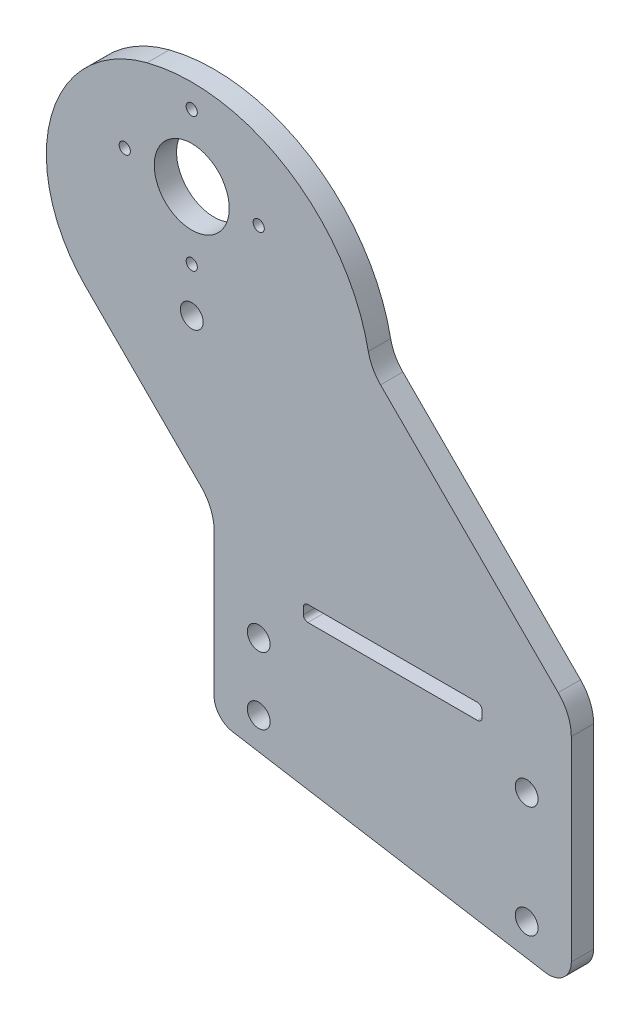
ISO-10303-21;
HEADER;
FILE_DESCRIPTION(('STEP AP214'),'2;1');
FILE_NAME('part.step','',(''),(''),'','','');
FILE_SCHEMA(('AUTOMOTIVE_DESIGN { 1 0 10303 214 1 1 1 1 }'));
ENDSEC;
DATA;
#1=APPLICATION_CONTEXT('core data for automotive mechanical design processes');
#2=APPLICATION_PROTOCOL_DEFINITION('international standard','automotive_design',2000,#1);
#3=PRODUCT_CONTEXT('',#1,'mechanical');
#4=PRODUCT('Part','Part','',(#3));
#5=PRODUCT_RELATED_PRODUCT_CATEGORY('part','',(#4));
#6=PRODUCT_DEFINITION_FORMATION('','',#4);
#7=PRODUCT_DEFINITION_CONTEXT('part definition',#1,'design');
#8=PRODUCT_DEFINITION('design','',#6,#7);
#9=PRODUCT_DEFINITION_SHAPE('','',#8);
#10=(LENGTH_UNIT() NAMED_UNIT(*) SI_UNIT(.MILLI.,.METRE.));
#11=(NAMED_UNIT(*) PLANE_ANGLE_UNIT() SI_UNIT($,.RADIAN.));
#12=(NAMED_UNIT(*) SI_UNIT($,.STERADIAN.) SOLID_ANGLE_UNIT());
#13=UNCERTAINTY_MEASURE_WITH_UNIT(LENGTH_MEASURE(1.E-05),#10,'distance_accuracy_value','');
#14=(GEOMETRIC_REPRESENTATION_CONTEXT(3) GLOBAL_UNCERTAINTY_ASSIGNED_CONTEXT((#13)) GLOBAL_UNIT_ASSIGNED_CONTEXT((#10,
#11,#12)) REPRESENTATION_CONTEXT('',''));
#15=CARTESIAN_POINT('',(0.,0.,0.));
#16=DIRECTION('',(0.,0.,1.));
#17=DIRECTION('',(1.,0.,0.));
#18=AXIS2_PLACEMENT_3D('',#15,#16,#17);
#19=CARTESIAN_POINT('',(0.,28.5999999999999,5.));
#20=DIRECTION('',(0.,0.,-1.));
#21=DIRECTION('',(-1.,0.,0.));
#22=AXIS2_PLACEMENT_3D('',#19,#20,#21);
#23=PLANE('',#22);
#24=CARTESIAN_POINT('',(0.,63.6,5.));
#25=DIRECTION('',(0.,0.,1.));
#26=DIRECTION('',(1.,0.,0.));
#27=AXIS2_PLACEMENT_3D('',#24,#25,#26);
#28=CIRCLE('',#27,1.25);
#29=CARTESIAN_POINT('',(1.25,63.6,5.));
#30=VERTEX_POINT('',#29);
#31=EDGE_CURVE('E308',#30,#30,#28,.T.);
#32=ORIENTED_EDGE('',*,*,#31,.F.);
#33=EDGE_LOOP('',(#32));
#34=FACE_BOUND('',#33,.T.);
#35=CARTESIAN_POINT('',(15.,48.6,5.));
#36=DIRECTION('',(0.,0.,1.));
#37=DIRECTION('',(1.,0.,0.));
#38=AXIS2_PLACEMENT_3D('',#35,#36,#37);
#39=CIRCLE('',#38,1.25);
#40=CARTESIAN_POINT('',(16.25,48.6,5.));
#41=VERTEX_POINT('',#40);
#42=EDGE_CURVE('E683',#41,#41,#39,.T.);
#43=ORIENTED_EDGE('',*,*,#42,.F.);
#44=EDGE_LOOP('',(#43));
#45=FACE_BOUND('',#44,.T.);
#46=CARTESIAN_POINT('',(0.,33.5999999999999,5.));
#47=DIRECTION('',(0.,0.,1.));
#48=DIRECTION('',(1.,0.,0.));
#49=AXIS2_PLACEMENT_3D('',#46,#47,#48);
#50=CIRCLE('',#49,1.25);
#51=CARTESIAN_POINT('',(1.25,33.5999999999999,5.));
#52=VERTEX_POINT('',#51);
#53=EDGE_CURVE('E691',#52,#52,#50,.T.);
#54=ORIENTED_EDGE('',*,*,#53,.F.);
#55=EDGE_LOOP('',(#54));
#56=FACE_BOUND('',#55,.T.);
#57=CARTESIAN_POINT('',(-15.,48.5999999999999,5.));
#58=DIRECTION('',(0.,0.,1.));
#59=DIRECTION('',(1.,0.,0.));
#60=AXIS2_PLACEMENT_3D('',#57,#58,#59);
#61=CIRCLE('',#60,1.25);
#62=CARTESIAN_POINT('',(-13.75,48.5999999999999,5.));
#63=VERTEX_POINT('',#62);
#64=EDGE_CURVE('E696',#63,#63,#61,.T.);
#65=ORIENTED_EDGE('',*,*,#64,.F.);
#66=EDGE_LOOP('',(#65));
#67=FACE_BOUND('',#66,.T.);
#68=DIRECTION('',(0.,1.,0.));
#69=VECTOR('',#68,1.);
#70=CARTESIAN_POINT('',(25.,-19.8999999999999,5.));
#71=LINE('',#70,#69);
#72=CARTESIAN_POINT('',(25.,-21.8999999999999,5.));
#73=VERTEX_POINT('',#72);
#74=CARTESIAN_POINT('',(25.,-20.3999999999999,5.));
#75=VERTEX_POINT('',#74);
#76=EDGE_CURVE('E318',#73,#75,#71,.T.);
#77=ORIENTED_EDGE('',*,*,#76,.T.);
#78=CARTESIAN_POINT('',(26.,-20.3999999999999,5.));
#79=DIRECTION('',(0.,0.,-1.));
#80=DIRECTION('',(-1.,0.,0.));
#81=AXIS2_PLACEMENT_3D('',#78,#79,#80);
#82=CIRCLE('',#81,1.);
#83=CARTESIAN_POINT('',(26.,-19.3999999999999,5.));
#84=VERTEX_POINT('',#83);
#85=EDGE_CURVE('E272',#75,#84,#82,.T.);
#86=ORIENTED_EDGE('',*,*,#85,.T.);
#87=DIRECTION('',(1.,0.,0.));
#88=VECTOR('',#87,1.);
#89=CARTESIAN_POINT('',(65.,-19.3999999999999,5.));
#90=LINE('',#89,#88);
#91=CARTESIAN_POINT('',(64.,-19.3999999999999,5.));
#92=VERTEX_POINT('',#91);
#93=EDGE_CURVE('E312',#84,#92,#90,.T.);
#94=ORIENTED_EDGE('',*,*,#93,.T.);
#95=CARTESIAN_POINT('',(64.,-20.3999999999999,5.));
#96=DIRECTION('',(0.,0.,-1.));
#97=DIRECTION('',(-1.,0.,0.));
#98=AXIS2_PLACEMENT_3D('',#95,#96,#97);
#99=CIRCLE('',#98,1.);
#100=CARTESIAN_POINT('',(65.,-20.3999999999999,5.));
#101=VERTEX_POINT('',#100);
#102=EDGE_CURVE('E260',#92,#101,#99,.T.);
#103=ORIENTED_EDGE('',*,*,#102,.T.);
#104=DIRECTION('',(0.,-1.,0.));
#105=VECTOR('',#104,1.);
#106=CARTESIAN_POINT('',(65.,-19.8999999999999,5.));
#107=LINE('',#106,#105);
#108=CARTESIAN_POINT('',(65.,-21.8999999999999,5.));
#109=VERTEX_POINT('',#108);
#110=EDGE_CURVE('E321',#101,#109,#107,.T.);
#111=ORIENTED_EDGE('',*,*,#110,.T.);
#112=CARTESIAN_POINT('',(64.,-21.8999999999999,5.));
#113=DIRECTION('',(0.,0.,-1.));
#114=DIRECTION('',(-1.,0.,0.));
#115=AXIS2_PLACEMENT_3D('',#112,#113,#114);
#116=CIRCLE('',#115,1.);
#117=CARTESIAN_POINT('',(64.,-22.8999999999999,5.));
#118=VERTEX_POINT('',#117);
#119=EDGE_CURVE('E264',#109,#118,#116,.T.);
#120=ORIENTED_EDGE('',*,*,#119,.T.);
#121=DIRECTION('',(-1.,0.,0.));
#122=VECTOR('',#121,1.);
#123=CARTESIAN_POINT('',(65.,-22.8999999999999,5.));
#124=LINE('',#123,#122);
#125=CARTESIAN_POINT('',(26.,-22.8999999999999,5.));
#126=VERTEX_POINT('',#125);
#127=EDGE_CURVE('E325',#118,#126,#124,.T.);
#128=ORIENTED_EDGE('',*,*,#127,.T.);
#129=CARTESIAN_POINT('',(26.,-21.8999999999999,5.));
#130=DIRECTION('',(0.,0.,-1.));
#131=DIRECTION('',(-1.,0.,0.));
#132=AXIS2_PLACEMENT_3D('',#129,#130,#131);
#133=CIRCLE('',#132,1.);
#134=EDGE_CURVE('E268',#126,#73,#133,.T.);
#135=ORIENTED_EDGE('',*,*,#134,.T.);
#136=EDGE_LOOP('',(#77,#86,#94,#103,#111,#120,#128,#135));
#137=FACE_BOUND('',#136,.T.);
#138=CARTESIAN_POINT('',(15.,-46.3999999999999,5.));
#139=DIRECTION('',(0.,0.,1.));
#140=DIRECTION('',(1.,0.,0.));
#141=AXIS2_PLACEMENT_3D('',#138,#139,#140);
#142=CIRCLE('',#141,2.54999999999999);
#143=CARTESIAN_POINT('',(17.55,-46.3999999999999,5.));
#144=VERTEX_POINT('',#143);
#145=EDGE_CURVE('E340',#144,#144,#142,.T.);
#146=ORIENTED_EDGE('',*,*,#145,.F.);
#147=EDGE_LOOP('',(#146));
#148=FACE_BOUND('',#147,.T.);
#149=CARTESIAN_POINT('',(15.,-31.3999999999999,5.));
#150=DIRECTION('',(0.,0.,1.));
#151=DIRECTION('',(1.,0.,0.));
#152=AXIS2_PLACEMENT_3D('',#149,#150,#151);
#153=CIRCLE('',#152,2.54999999999999);
#154=CARTESIAN_POINT('',(17.55,-31.3999999999999,5.));
#155=VERTEX_POINT('',#154);
#156=EDGE_CURVE('E328',#155,#155,#153,.T.);
#157=ORIENTED_EDGE('',*,*,#156,.F.);
#158=EDGE_LOOP('',(#157));
#159=FACE_BOUND('',#158,.T.);
#160=DIRECTION('',(0.986393923832144,-0.164398987305357,0.));
#161=VECTOR('',#160,1.);
#162=CARTESIAN_POINT('',(5.00000000000002,-51.8298896186812,5.));
#163=LINE('',#162,#161);
#164=CARTESIAN_POINT('',(9.17800506347324,-52.5262237959267,5.));
#165=VERTEX_POINT('',#164);
#166=CARTESIAN_POINT('',(79.1780050634732,-64.1928904625934,5.));
#167=VERTEX_POINT('',#166);
#168=EDGE_CURVE('E291',#165,#167,#163,.T.);
#169=ORIENTED_EDGE('',*,*,#168,.T.);
#170=CARTESIAN_POINT('',(80.,-59.2609208434327,5.));
#171=DIRECTION('',(0.,0.,-1.));
#172=DIRECTION('',(-1.,0.,0.));
#173=AXIS2_PLACEMENT_3D('',#170,#171,#172);
#174=CIRCLE('',#173,5.);
#175=CARTESIAN_POINT('',(85.,-59.2609208434327,5.));
#176=VERTEX_POINT('',#175);
#177=EDGE_CURVE('E41',#167,#176,#174,.F.);
#178=ORIENTED_EDGE('',*,*,#177,.T.);
#179=DIRECTION('',(0.,1.,0.));
#180=VECTOR('',#179,1.);
#181=CARTESIAN_POINT('',(85.,-11.3999999999999,5.));
#182=LINE('',#181,#180);
#183=CARTESIAN_POINT('',(85.,-15.5421356237309,5.));
#184=VERTEX_POINT('',#183);
#185=EDGE_CURVE('E290',#176,#184,#182,.T.);
#186=ORIENTED_EDGE('',*,*,#185,.T.);
#187=CARTESIAN_POINT('',(75.,-15.5421356237309,5.));
#188=DIRECTION('',(0.,0.,-1.));
#189=DIRECTION('',(-1.,0.,0.));
#190=AXIS2_PLACEMENT_3D('',#187,#188,#189);
#191=CIRCLE('',#190,10.);
#192=CARTESIAN_POINT('',(82.0710678118655,-8.4710678118654,5.));
#193=VERTEX_POINT('',#192);
#194=EDGE_CURVE('E210',#184,#193,#191,.F.);
#195=ORIENTED_EDGE('',*,*,#194,.T.);
#196=DIRECTION('',(-0.707106781186549,0.707106781186546,0.));
#197=VECTOR('',#196,1.);
#198=CARTESIAN_POINT('',(40.,33.6,5.));
#199=LINE('',#198,#197);
#200=CARTESIAN_POINT('',(42.2778875484967,31.3221124515032,5.));
#201=VERTEX_POINT('',#200);
#202=EDGE_CURVE('E191',#193,#201,#199,.T.);
#203=ORIENTED_EDGE('',*,*,#202,.T.);
#204=CARTESIAN_POINT('',(49.3489553603622,38.3931802633687,5.));
#205=DIRECTION('',(0.,0.,-1.));
#206=DIRECTION('',(-1.,0.,0.));
#207=AXIS2_PLACEMENT_3D('',#204,#205,#206);
#208=CIRCLE('',#207,10.);
#209=CARTESIAN_POINT('',(39.5402311963033,36.4466627901854,5.));
#210=VERTEX_POINT('',#209);
#211=EDGE_CURVE('E222',#201,#210,#208,.T.);
#212=ORIENTED_EDGE('',*,*,#211,.T.);
#213=CARTESIAN_POINT('',(0.,28.5999999999999,5.));
#214=DIRECTION('',(0.,0.,1.));
#215=DIRECTION('',(-1.,0.,0.));
#216=AXIS2_PLACEMENT_3D('',#213,#214,#215);
#217=CIRCLE('',#216,40.3112887414928);
#218=CARTESIAN_POINT('',(-10.0144960516839,67.6475334538662,5.));
#219=VERTEX_POINT('',#218);
#220=EDGE_CURVE('E198',#210,#219,#217,.T.);
#221=ORIENTED_EDGE('',*,*,#220,.T.);
#222=CARTESIAN_POINT('',(-2.56162389279218,38.588030763985,5.));
#223=DIRECTION('',(0.,0.,-1.));
#224=DIRECTION('',(-1.,0.,0.));
#225=AXIS2_PLACEMENT_3D('',#222,#223,#224);
#226=CIRCLE('',#225,30.);
#227=CARTESIAN_POINT('',(-23.7748273283886,17.3748273283886,5.));
#228=VERTEX_POINT('',#227);
#229=EDGE_CURVE('E236',#219,#228,#226,.F.);
#230=ORIENTED_EDGE('',*,*,#229,.T.);
#231=DIRECTION('',(0.707106781186547,-0.707106781186547,0.));
#232=VECTOR('',#231,1.);
#233=CARTESIAN_POINT('',(-40.,33.6,5.));
#234=LINE('',#233,#232);
#235=CARTESIAN_POINT('',(2.07106781186549,-8.47106781186555,5.));
#236=VERTEX_POINT('',#235);
#237=EDGE_CURVE('E202',#228,#236,#234,.T.);
#238=ORIENTED_EDGE('',*,*,#237,.T.);
#239=CARTESIAN_POINT('',(-4.99999999999998,-15.542135623731,5.));
#240=DIRECTION('',(0.,0.,-1.));
#241=DIRECTION('',(-1.,0.,0.));
#242=AXIS2_PLACEMENT_3D('',#239,#240,#241);
#243=CIRCLE('',#242,10.);
#244=CARTESIAN_POINT('',(5.00000000000002,-15.542135623731,5.));
#245=VERTEX_POINT('',#244);
#246=EDGE_CURVE('E227',#236,#245,#243,.T.);
#247=ORIENTED_EDGE('',*,*,#246,.T.);
#248=DIRECTION('',(0.,-1.,0.));
#249=VECTOR('',#248,1.);
#250=CARTESIAN_POINT('',(5.00000000000002,-11.4000000000001,5.));
#251=LINE('',#250,#249);
#252=CARTESIAN_POINT('',(5.00000000000003,-47.594254176766,5.));
#253=VERTEX_POINT('',#252);
#254=EDGE_CURVE('E296',#245,#253,#251,.T.);
#255=ORIENTED_EDGE('',*,*,#254,.T.);
#256=CARTESIAN_POINT('',(10.,-47.594254176766,5.));
#257=DIRECTION('',(0.,0.,-1.));
#258=DIRECTION('',(-1.,0.,0.));
#259=AXIS2_PLACEMENT_3D('',#256,#257,#258);
#260=CIRCLE('',#259,5.);
#261=EDGE_CURVE('E285',#253,#165,#260,.F.);
#262=ORIENTED_EDGE('',*,*,#261,.T.);
#263=EDGE_LOOP('',(#169,#178,#186,#195,#203,#212,#221,#230,#238,#247,#255,#262));
#264=FACE_BOUND('',#263,.T.);
#265=CARTESIAN_POINT('',(75.,-31.3999999999999,5.));
#266=DIRECTION('',(0.,0.,1.));
#267=DIRECTION('',(1.,0.,0.));
#268=AXIS2_PLACEMENT_3D('',#265,#266,#267);
#269=CIRCLE('',#268,2.54999999999999);
#270=CARTESIAN_POINT('',(77.55,-31.3999999999999,5.));
#271=VERTEX_POINT('',#270);
#272=EDGE_CURVE('E366',#271,#271,#269,.T.);
#273=ORIENTED_EDGE('',*,*,#272,.F.);
#274=EDGE_LOOP('',(#273));
#275=FACE_BOUND('',#274,.T.);
#276=CARTESIAN_POINT('',(75.,-56.3999999999999,5.));
#277=DIRECTION('',(0.,0.,1.));
#278=DIRECTION('',(1.,0.,0.));
#279=AXIS2_PLACEMENT_3D('',#276,#277,#278);
#280=CIRCLE('',#279,2.54999999999999);
#281=CARTESIAN_POINT('',(77.55,-56.3999999999999,5.));
#282=VERTEX_POINT('',#281);
#283=EDGE_CURVE('E360',#282,#282,#280,.T.);
#284=ORIENTED_EDGE('',*,*,#283,.F.);
#285=EDGE_LOOP('',(#284));
#286=FACE_BOUND('',#285,.T.);
#287=CARTESIAN_POINT('',(0.,23.6,5.));
#288=DIRECTION('',(0.,0.,1.));
#289=DIRECTION('',(1.,0.,0.));
#290=AXIS2_PLACEMENT_3D('',#287,#288,#289);
#291=CIRCLE('',#290,2.55);
#292=CARTESIAN_POINT('',(2.55000000000001,23.6,5.));
#293=VERTEX_POINT('',#292);
#294=EDGE_CURVE('E354',#293,#293,#291,.T.);
#295=ORIENTED_EDGE('',*,*,#294,.F.);
#296=EDGE_LOOP('',(#295));
#297=FACE_BOUND('',#296,.T.);
#298=CARTESIAN_POINT('',(0.,48.6,5.));
#299=DIRECTION('',(0.,0.,1.));
#300=DIRECTION('',(1.,0.,0.));
#301=AXIS2_PLACEMENT_3D('',#298,#299,#300);
#302=CIRCLE('',#301,8.4);
#303=CARTESIAN_POINT('',(8.4,48.6,5.));
#304=VERTEX_POINT('',#303);
#305=EDGE_CURVE('E348',#304,#304,#302,.T.);
#306=ORIENTED_EDGE('',*,*,#305,.F.);
#307=EDGE_LOOP('',(#306));
#308=FACE_BOUND('',#307,.T.);
#309=ADVANCED_FACE('F33',(#34,#45,#56,#67,#137,#148,#159,#264,#275,#286,#297,#308),#23,.F.);
#310=CARTESIAN_POINT('',(0.,28.5999999999999,0.));
#311=DIRECTION('',(0.,0.,-1.));
#312=DIRECTION('',(-1.,0.,0.));
#313=AXIS2_PLACEMENT_3D('',#310,#311,#312);
#314=PLANE('',#313);
#315=CARTESIAN_POINT('',(0.,63.6,0.));
#316=DIRECTION('',(0.,0.,1.));
#317=DIRECTION('',(1.,0.,0.));
#318=AXIS2_PLACEMENT_3D('',#315,#316,#317);
#319=CIRCLE('',#318,1.25);
#320=CARTESIAN_POINT('',(1.25,63.6,0.));
#321=VERTEX_POINT('',#320);
#322=EDGE_CURVE('E303',#321,#321,#319,.T.);
#323=ORIENTED_EDGE('',*,*,#322,.T.);
#324=EDGE_LOOP('',(#323));
#325=FACE_BOUND('',#324,.T.);
#326=CARTESIAN_POINT('',(15.,48.6,0.));
#327=DIRECTION('',(0.,0.,1.));
#328=DIRECTION('',(1.,0.,0.));
#329=AXIS2_PLACEMENT_3D('',#326,#327,#328);
#330=CIRCLE('',#329,1.25);
#331=CARTESIAN_POINT('',(16.25,48.6,0.));
#332=VERTEX_POINT('',#331);
#333=EDGE_CURVE('E680',#332,#332,#330,.T.);
#334=ORIENTED_EDGE('',*,*,#333,.T.);
#335=EDGE_LOOP('',(#334));
#336=FACE_BOUND('',#335,.T.);
#337=CARTESIAN_POINT('',(0.,33.5999999999999,0.));
#338=DIRECTION('',(0.,0.,1.));
#339=DIRECTION('',(1.,0.,0.));
#340=AXIS2_PLACEMENT_3D('',#337,#338,#339);
#341=CIRCLE('',#340,1.25);
#342=CARTESIAN_POINT('',(1.25,33.5999999999999,0.));
#343=VERTEX_POINT('',#342);
#344=EDGE_CURVE('E688',#343,#343,#341,.T.);
#345=ORIENTED_EDGE('',*,*,#344,.T.);
#346=EDGE_LOOP('',(#345));
#347=FACE_BOUND('',#346,.T.);
#348=CARTESIAN_POINT('',(-15.,48.5999999999999,0.));
#349=DIRECTION('',(0.,0.,1.));
#350=DIRECTION('',(1.,0.,0.));
#351=AXIS2_PLACEMENT_3D('',#348,#349,#350);
#352=CIRCLE('',#351,1.25);
#353=CARTESIAN_POINT('',(-13.75,48.5999999999999,0.));
#354=VERTEX_POINT('',#353);
#355=EDGE_CURVE('E694',#354,#354,#352,.T.);
#356=ORIENTED_EDGE('',*,*,#355,.T.);
#357=EDGE_LOOP('',(#356));
#358=FACE_BOUND('',#357,.T.);
#359=DIRECTION('',(0.,1.,0.));
#360=VECTOR('',#359,1.);
#361=CARTESIAN_POINT('',(85.,-11.3999999999999,0.));
#362=LINE('',#361,#360);
#363=CARTESIAN_POINT('',(85.,-59.2609208434327,0.));
#364=VERTEX_POINT('',#363);
#365=CARTESIAN_POINT('',(85.,-15.5421356237309,0.));
#366=VERTEX_POINT('',#365);
#367=EDGE_CURVE('E199',#364,#366,#362,.T.);
#368=ORIENTED_EDGE('',*,*,#367,.F.);
#369=CARTESIAN_POINT('',(80.,-59.2609208434327,0.));
#370=DIRECTION('',(0.,0.,-1.));
#371=DIRECTION('',(-1.,0.,0.));
#372=AXIS2_PLACEMENT_3D('',#369,#370,#371);
#373=CIRCLE('',#372,5.);
#374=CARTESIAN_POINT('',(79.1780050634732,-64.1928904625934,0.));
#375=VERTEX_POINT('',#374);
#376=EDGE_CURVE('E279',#364,#375,#373,.T.);
#377=ORIENTED_EDGE('',*,*,#376,.T.);
#378=DIRECTION('',(0.986393923832144,-0.164398987305357,0.));
#379=VECTOR('',#378,1.);
#380=CARTESIAN_POINT('',(5.00000000000002,-51.8298896186812,0.));
#381=LINE('',#380,#379);
#382=CARTESIAN_POINT('',(9.17800506347324,-52.5262237959267,0.));
#383=VERTEX_POINT('',#382);
#384=EDGE_CURVE('E300',#383,#375,#381,.T.);
#385=ORIENTED_EDGE('',*,*,#384,.F.);
#386=CARTESIAN_POINT('',(10.,-47.594254176766,0.));
#387=DIRECTION('',(0.,0.,-1.));
#388=DIRECTION('',(-1.,0.,0.));
#389=AXIS2_PLACEMENT_3D('',#386,#387,#388);
#390=CIRCLE('',#389,5.);
#391=CARTESIAN_POINT('',(5.00000000000003,-47.594254176766,0.));
#392=VERTEX_POINT('',#391);
#393=EDGE_CURVE('E277',#383,#392,#390,.T.);
#394=ORIENTED_EDGE('',*,*,#393,.T.);
#395=DIRECTION('',(0.,-1.,0.));
#396=VECTOR('',#395,1.);
#397=CARTESIAN_POINT('',(5.00000000000002,-11.4000000000001,0.));
#398=LINE('',#397,#396);
#399=CARTESIAN_POINT('',(5.00000000000002,-15.542135623731,0.));
#400=VERTEX_POINT('',#399);
#401=EDGE_CURVE('E204',#400,#392,#398,.T.);
#402=ORIENTED_EDGE('',*,*,#401,.F.);
#403=CARTESIAN_POINT('',(-4.99999999999998,-15.542135623731,0.));
#404=DIRECTION('',(0.,0.,-1.));
#405=DIRECTION('',(-1.,0.,0.));
#406=AXIS2_PLACEMENT_3D('',#403,#404,#405);
#407=CIRCLE('',#406,10.);
#408=CARTESIAN_POINT('',(2.07106781186549,-8.47106781186555,0.));
#409=VERTEX_POINT('',#408);
#410=EDGE_CURVE('E224',#400,#409,#407,.F.);
#411=ORIENTED_EDGE('',*,*,#410,.T.);
#412=DIRECTION('',(0.707106781186547,-0.707106781186547,0.));
#413=VECTOR('',#412,1.);
#414=CARTESIAN_POINT('',(-40.,33.6,0.));
#415=LINE('',#414,#413);
#416=CARTESIAN_POINT('',(-23.7748273283886,17.3748273283886,0.));
#417=VERTEX_POINT('',#416);
#418=EDGE_CURVE('E377',#417,#409,#415,.T.);
#419=ORIENTED_EDGE('',*,*,#418,.F.);
#420=CARTESIAN_POINT('',(-2.56162389279218,38.588030763985,0.));
#421=DIRECTION('',(0.,0.,-1.));
#422=DIRECTION('',(-1.,0.,0.));
#423=AXIS2_PLACEMENT_3D('',#420,#421,#422);
#424=CIRCLE('',#423,30.);
#425=CARTESIAN_POINT('',(-10.0144960516839,67.6475334538662,0.));
#426=VERTEX_POINT('',#425);
#427=EDGE_CURVE('E232',#417,#426,#424,.T.);
#428=ORIENTED_EDGE('',*,*,#427,.T.);
#429=CARTESIAN_POINT('',(0.,28.5999999999999,0.));
#430=DIRECTION('',(0.,0.,1.));
#431=DIRECTION('',(-1.,0.,0.));
#432=AXIS2_PLACEMENT_3D('',#429,#430,#431);
#433=CIRCLE('',#432,40.3112887414928);
#434=CARTESIAN_POINT('',(39.5402311963033,36.4466627901854,0.));
#435=VERTEX_POINT('',#434);
#436=EDGE_CURVE('E369',#435,#426,#433,.T.);
#437=ORIENTED_EDGE('',*,*,#436,.F.);
#438=CARTESIAN_POINT('',(49.3489553603622,38.3931802633687,0.));
#439=DIRECTION('',(0.,0.,-1.));
#440=DIRECTION('',(-1.,0.,0.));
#441=AXIS2_PLACEMENT_3D('',#438,#439,#440);
#442=CIRCLE('',#441,10.);
#443=CARTESIAN_POINT('',(42.2778875484967,31.3221124515032,0.));
#444=VERTEX_POINT('',#443);
#445=EDGE_CURVE('E197',#435,#444,#442,.F.);
#446=ORIENTED_EDGE('',*,*,#445,.T.);
#447=DIRECTION('',(-0.707106781186549,0.707106781186546,0.));
#448=VECTOR('',#447,1.);
#449=CARTESIAN_POINT('',(40.,33.6,0.));
#450=LINE('',#449,#448);
#451=CARTESIAN_POINT('',(82.0710678118655,-8.4710678118654,0.));
#452=VERTEX_POINT('',#451);
#453=EDGE_CURVE('E188',#452,#444,#450,.T.);
#454=ORIENTED_EDGE('',*,*,#453,.F.);
#455=CARTESIAN_POINT('',(75.,-15.5421356237309,0.));
#456=DIRECTION('',(0.,0.,-1.));
#457=DIRECTION('',(-1.,0.,0.));
#458=AXIS2_PLACEMENT_3D('',#455,#456,#457);
#459=CIRCLE('',#458,10.);
#460=EDGE_CURVE('E173',#452,#366,#459,.T.);
#461=ORIENTED_EDGE('',*,*,#460,.T.);
#462=EDGE_LOOP('',(#368,#377,#385,#394,#402,#411,#419,#428,#437,#446,#454,#461));
#463=FACE_BOUND('',#462,.T.);
#464=DIRECTION('',(0.,-1.,0.));
#465=VECTOR('',#464,1.);
#466=CARTESIAN_POINT('',(65.,-19.8999999999999,0.));
#467=LINE('',#466,#465);
#468=CARTESIAN_POINT('',(65.,-20.3999999999999,0.));
#469=VERTEX_POINT('',#468);
#470=CARTESIAN_POINT('',(65.,-21.8999999999999,0.));
#471=VERTEX_POINT('',#470);
#472=EDGE_CURVE('E331',#469,#471,#467,.T.);
#473=ORIENTED_EDGE('',*,*,#472,.F.);
#474=CARTESIAN_POINT('',(64.,-20.3999999999999,0.));
#475=DIRECTION('',(0.,0.,-1.));
#476=DIRECTION('',(-1.,0.,0.));
#477=AXIS2_PLACEMENT_3D('',#474,#475,#476);
#478=CIRCLE('',#477,1.);
#479=CARTESIAN_POINT('',(64.,-19.3999999999999,0.));
#480=VERTEX_POINT('',#479);
#481=EDGE_CURVE('E258',#469,#480,#478,.F.);
#482=ORIENTED_EDGE('',*,*,#481,.T.);
#483=DIRECTION('',(1.,0.,0.));
#484=VECTOR('',#483,1.);
#485=CARTESIAN_POINT('',(65.,-19.3999999999999,0.));
#486=LINE('',#485,#484);
#487=CARTESIAN_POINT('',(26.,-19.3999999999999,0.));
#488=VERTEX_POINT('',#487);
#489=EDGE_CURVE('E305',#488,#480,#486,.T.);
#490=ORIENTED_EDGE('',*,*,#489,.F.);
#491=CARTESIAN_POINT('',(26.,-20.3999999999999,0.));
#492=DIRECTION('',(0.,0.,-1.));
#493=DIRECTION('',(-1.,0.,0.));
#494=AXIS2_PLACEMENT_3D('',#491,#492,#493);
#495=CIRCLE('',#494,1.);
#496=CARTESIAN_POINT('',(25.,-20.3999999999999,0.));
#497=VERTEX_POINT('',#496);
#498=EDGE_CURVE('E270',#488,#497,#495,.F.);
#499=ORIENTED_EDGE('',*,*,#498,.T.);
#500=DIRECTION('',(0.,1.,0.));
#501=VECTOR('',#500,1.);
#502=CARTESIAN_POINT('',(25.,-19.8999999999999,0.));
#503=LINE('',#502,#501);
#504=CARTESIAN_POINT('',(25.,-21.8999999999999,0.));
#505=VERTEX_POINT('',#504);
#506=EDGE_CURVE('E315',#505,#497,#503,.T.);
#507=ORIENTED_EDGE('',*,*,#506,.F.);
#508=CARTESIAN_POINT('',(26.,-21.8999999999999,0.));
#509=DIRECTION('',(0.,0.,-1.));
#510=DIRECTION('',(-1.,0.,0.));
#511=AXIS2_PLACEMENT_3D('',#508,#509,#510);
#512=CIRCLE('',#511,1.);
#513=CARTESIAN_POINT('',(26.,-22.8999999999999,0.));
#514=VERTEX_POINT('',#513);
#515=EDGE_CURVE('E266',#505,#514,#512,.F.);
#516=ORIENTED_EDGE('',*,*,#515,.T.);
#517=DIRECTION('',(-1.,0.,0.));
#518=VECTOR('',#517,1.);
#519=CARTESIAN_POINT('',(65.,-22.8999999999999,0.));
#520=LINE('',#519,#518);
#521=CARTESIAN_POINT('',(64.,-22.8999999999999,0.));
#522=VERTEX_POINT('',#521);
#523=EDGE_CURVE('E322',#522,#514,#520,.T.);
#524=ORIENTED_EDGE('',*,*,#523,.F.);
#525=CARTESIAN_POINT('',(64.,-21.8999999999999,0.));
#526=DIRECTION('',(0.,0.,-1.));
#527=DIRECTION('',(-1.,0.,0.));
#528=AXIS2_PLACEMENT_3D('',#525,#526,#527);
#529=CIRCLE('',#528,1.);
#530=EDGE_CURVE('E262',#522,#471,#529,.F.);
#531=ORIENTED_EDGE('',*,*,#530,.T.);
#532=EDGE_LOOP('',(#473,#482,#490,#499,#507,#516,#524,#531));
#533=FACE_BOUND('',#532,.T.);
#534=CARTESIAN_POINT('',(15.,-46.3999999999999,0.));
#535=DIRECTION('',(0.,0.,1.));
#536=DIRECTION('',(1.,0.,0.));
#537=AXIS2_PLACEMENT_3D('',#534,#535,#536);
#538=CIRCLE('',#537,2.54999999999999);
#539=CARTESIAN_POINT('',(17.55,-46.3999999999999,0.));
#540=VERTEX_POINT('',#539);
#541=EDGE_CURVE('E336',#540,#540,#538,.T.);
#542=ORIENTED_EDGE('',*,*,#541,.T.);
#543=EDGE_LOOP('',(#542));
#544=FACE_BOUND('',#543,.T.);
#545=CARTESIAN_POINT('',(15.,-31.3999999999999,0.));
#546=DIRECTION('',(0.,0.,1.));
#547=DIRECTION('',(1.,0.,0.));
#548=AXIS2_PLACEMENT_3D('',#545,#546,#547);
#549=CIRCLE('',#548,2.54999999999999);
#550=CARTESIAN_POINT('',(17.55,-31.3999999999999,0.));
#551=VERTEX_POINT('',#550);
#552=EDGE_CURVE('E343',#551,#551,#549,.T.);
#553=ORIENTED_EDGE('',*,*,#552,.T.);
#554=EDGE_LOOP('',(#553));
#555=FACE_BOUND('',#554,.T.);
#556=CARTESIAN_POINT('',(0.,23.6,0.));
#557=DIRECTION('',(0.,0.,1.));
#558=DIRECTION('',(1.,0.,0.));
#559=AXIS2_PLACEMENT_3D('',#556,#557,#558);
#560=CIRCLE('',#559,2.55);
#561=CARTESIAN_POINT('',(2.55000000000001,23.6,0.));
#562=VERTEX_POINT('',#561);
#563=EDGE_CURVE('E351',#562,#562,#560,.T.);
#564=ORIENTED_EDGE('',*,*,#563,.T.);
#565=EDGE_LOOP('',(#564));
#566=FACE_BOUND('',#565,.T.);
#567=CARTESIAN_POINT('',(75.,-31.3999999999999,0.));
#568=DIRECTION('',(0.,0.,1.));
#569=DIRECTION('',(1.,0.,0.));
#570=AXIS2_PLACEMENT_3D('',#567,#568,#569);
#571=CIRCLE('',#570,2.54999999999999);
#572=CARTESIAN_POINT('',(77.55,-31.3999999999999,0.));
#573=VERTEX_POINT('',#572);
#574=EDGE_CURVE('E363',#573,#573,#571,.T.);
#575=ORIENTED_EDGE('',*,*,#574,.T.);
#576=EDGE_LOOP('',(#575));
#577=FACE_BOUND('',#576,.T.);
#578=CARTESIAN_POINT('',(75.,-56.3999999999999,0.));
#579=DIRECTION('',(0.,0.,1.));
#580=DIRECTION('',(1.,0.,0.));
#581=AXIS2_PLACEMENT_3D('',#578,#579,#580);
#582=CIRCLE('',#581,2.54999999999999);
#583=CARTESIAN_POINT('',(77.55,-56.3999999999999,0.));
#584=VERTEX_POINT('',#583);
#585=EDGE_CURVE('E357',#584,#584,#582,.T.);
#586=ORIENTED_EDGE('',*,*,#585,.T.);
#587=EDGE_LOOP('',(#586));
#588=FACE_BOUND('',#587,.T.);
#589=CARTESIAN_POINT('',(0.,48.6,0.));
#590=DIRECTION('',(0.,0.,1.));
#591=DIRECTION('',(1.,0.,0.));
#592=AXIS2_PLACEMENT_3D('',#589,#590,#591);
#593=CIRCLE('',#592,8.4);
#594=CARTESIAN_POINT('',(8.4,48.6,0.));
#595=VERTEX_POINT('',#594);
#596=EDGE_CURVE('E339',#595,#595,#593,.T.);
#597=ORIENTED_EDGE('',*,*,#596,.T.);
#598=EDGE_LOOP('',(#597));
#599=FACE_BOUND('',#598,.T.);
#600=ADVANCED_FACE('F194',(#325,#336,#347,#358,#463,#533,#544,#555,#566,#577,#588,#599),#314,.T.);
#601=CARTESIAN_POINT('',(0.,28.5999999999999,5.));
#602=DIRECTION('',(0.,0.,-1.));
#603=DIRECTION('',(-1.,0.,0.));
#604=AXIS2_PLACEMENT_3D('',#601,#602,#603);
#605=CYLINDRICAL_SURFACE('',#604,40.3112887414928);
#606=ORIENTED_EDGE('',*,*,#436,.T.);
#607=DIRECTION('',(0.,0.,-1.));
#608=VECTOR('',#607,1.);
#609=CARTESIAN_POINT('',(-10.0144960516839,67.6475334538662,5.));
#610=LINE('',#609,#608);
#611=EDGE_CURVE('E234',#426,#219,#610,.F.);
#612=ORIENTED_EDGE('',*,*,#611,.T.);
#613=ORIENTED_EDGE('',*,*,#220,.F.);
#614=DIRECTION('',(0.,0.,-1.));
#615=VECTOR('',#614,1.);
#616=CARTESIAN_POINT('',(39.5402311963033,36.4466627901854,5.));
#617=LINE('',#616,#615);
#618=EDGE_CURVE('E212',#210,#435,#617,.T.);
#619=ORIENTED_EDGE('',*,*,#618,.T.);
#620=EDGE_LOOP('',(#606,#612,#613,#619));
#621=FACE_BOUND('',#620,.T.);
#622=ADVANCED_FACE('F398',(#621),#605,.T.);
#623=CARTESIAN_POINT('',(-40.,33.6,5.));
#624=DIRECTION('',(0.707106781186548,0.707106781186548,0.));
#625=DIRECTION('',(-0.707106781186548,0.707106781186548,0.));
#626=AXIS2_PLACEMENT_3D('',#623,#624,#625);
#627=PLANE('',#626);
#628=ORIENTED_EDGE('',*,*,#237,.F.);
#629=DIRECTION('',(0.,0.,-1.));
#630=VECTOR('',#629,1.);
#631=CARTESIAN_POINT('',(-23.7748273283886,17.3748273283886,5.));
#632=LINE('',#631,#630);
#633=EDGE_CURVE('E229',#228,#417,#632,.T.);
#634=ORIENTED_EDGE('',*,*,#633,.T.);
#635=ORIENTED_EDGE('',*,*,#418,.T.);
#636=DIRECTION('',(0.,0.,-1.));
#637=VECTOR('',#636,1.);
#638=CARTESIAN_POINT('',(2.0710678118655,-8.47106781186555,5.));
#639=LINE('',#638,#637);
#640=EDGE_CURVE('E218',#409,#236,#639,.F.);
#641=ORIENTED_EDGE('',*,*,#640,.T.);
#642=EDGE_LOOP('',(#628,#634,#635,#641));
#643=FACE_BOUND('',#642,.T.);
#644=ADVANCED_FACE('F390',(#643),#627,.F.);
#645=CARTESIAN_POINT('',(5.00000000000002,-11.4000000000001,5.));
#646=DIRECTION('',(1.,0.,0.));
#647=DIRECTION('',(0.,1.,0.));
#648=AXIS2_PLACEMENT_3D('',#645,#646,#647);
#649=PLANE('',#648);
#650=ORIENTED_EDGE('',*,*,#401,.T.);
#651=DIRECTION('',(0.,0.,-1.));
#652=VECTOR('',#651,1.);
#653=CARTESIAN_POINT('',(5.00000000000003,-47.594254176766,5.));
#654=LINE('',#653,#652);
#655=EDGE_CURVE('E11',#392,#253,#654,.F.);
#656=ORIENTED_EDGE('',*,*,#655,.T.);
#657=ORIENTED_EDGE('',*,*,#254,.F.);
#658=DIRECTION('',(0.,0.,-1.));
#659=VECTOR('',#658,1.);
#660=CARTESIAN_POINT('',(5.00000000000002,-15.542135623731,0.));
#661=LINE('',#660,#659);
#662=EDGE_CURVE('E215',#245,#400,#661,.T.);
#663=ORIENTED_EDGE('',*,*,#662,.T.);
#664=EDGE_LOOP('',(#650,#656,#657,#663));
#665=FACE_BOUND('',#664,.T.);
#666=ADVANCED_FACE('F379',(#665),#649,.F.);
#667=CARTESIAN_POINT('',(85.,-11.3999999999999,5.));
#668=DIRECTION('',(-1.,0.,0.));
#669=DIRECTION('',(0.,0.,1.));
#670=AXIS2_PLACEMENT_3D('',#667,#668,#669);
#671=PLANE('',#670);
#672=ORIENTED_EDGE('',*,*,#185,.F.);
#673=DIRECTION('',(0.,0.,-1.));
#674=VECTOR('',#673,1.);
#675=CARTESIAN_POINT('',(85.,-59.2609208434327,5.));
#676=LINE('',#675,#674);
#677=EDGE_CURVE('E274',#176,#364,#676,.T.);
#678=ORIENTED_EDGE('',*,*,#677,.T.);
#679=ORIENTED_EDGE('',*,*,#367,.T.);
#680=DIRECTION('',(0.,0.,-1.));
#681=VECTOR('',#680,1.);
#682=CARTESIAN_POINT('',(85.,-15.5421356237309,5.));
#683=LINE('',#682,#681);
#684=EDGE_CURVE('E179',#366,#184,#683,.F.);
#685=ORIENTED_EDGE('',*,*,#684,.T.);
#686=EDGE_LOOP('',(#672,#678,#679,#685));
#687=FACE_BOUND('',#686,.T.);
#688=ADVANCED_FACE('F295',(#687),#671,.F.);
#689=CARTESIAN_POINT('',(40.,33.6,5.));
#690=DIRECTION('',(-0.707106781186546,-0.707106781186549,0.));
#691=DIRECTION('',(0.707106781186549,-0.707106781186546,0.));
#692=AXIS2_PLACEMENT_3D('',#689,#690,#691);
#693=PLANE('',#692);
#694=ORIENTED_EDGE('',*,*,#202,.F.);
#695=DIRECTION('',(0.,0.,-1.));
#696=VECTOR('',#695,1.);
#697=CARTESIAN_POINT('',(82.0710678118655,-8.4710678118654,5.));
#698=LINE('',#697,#696);
#699=EDGE_CURVE('E177',#193,#452,#698,.T.);
#700=ORIENTED_EDGE('',*,*,#699,.T.);
#701=ORIENTED_EDGE('',*,*,#453,.T.);
#702=DIRECTION('',(0.,0.,1.));
#703=VECTOR('',#702,1.);
#704=CARTESIAN_POINT('',(42.2778875484967,31.3221124515032,5.));
#705=LINE('',#704,#703);
#706=EDGE_CURVE('E192',#444,#201,#705,.T.);
#707=ORIENTED_EDGE('',*,*,#706,.T.);
#708=EDGE_LOOP('',(#694,#700,#701,#707));
#709=FACE_BOUND('',#708,.T.);
#710=ADVANCED_FACE('F187',(#709),#693,.F.);
#711=CARTESIAN_POINT('',(75.,-31.3999999999999,5.));
#712=DIRECTION('',(0.,0.,-1.));
#713=DIRECTION('',(-1.,0.,0.));
#714=AXIS2_PLACEMENT_3D('',#711,#712,#713);
#715=CYLINDRICAL_SURFACE('',#714,2.54999999999999);
#716=ORIENTED_EDGE('',*,*,#272,.T.);
#717=EDGE_LOOP('',(#716));
#718=FACE_BOUND('',#717,.T.);
#719=ORIENTED_EDGE('',*,*,#574,.F.);
#720=EDGE_LOOP('',(#719));
#721=FACE_BOUND('',#720,.T.);
#722=ADVANCED_FACE('F424',(#718,#721),#715,.F.);
#723=CARTESIAN_POINT('',(75.,-56.3999999999999,5.));
#724=DIRECTION('',(0.,0.,-1.));
#725=DIRECTION('',(-1.,0.,0.));
#726=AXIS2_PLACEMENT_3D('',#723,#724,#725);
#727=CYLINDRICAL_SURFACE('',#726,2.54999999999999);
#728=ORIENTED_EDGE('',*,*,#283,.T.);
#729=EDGE_LOOP('',(#728));
#730=FACE_BOUND('',#729,.T.);
#731=ORIENTED_EDGE('',*,*,#585,.F.);
#732=EDGE_LOOP('',(#731));
#733=FACE_BOUND('',#732,.T.);
#734=ADVANCED_FACE('F468',(#730,#733),#727,.F.);
#735=CARTESIAN_POINT('',(0.,23.6,5.));
#736=DIRECTION('',(0.,0.,-1.));
#737=DIRECTION('',(-1.,0.,0.));
#738=AXIS2_PLACEMENT_3D('',#735,#736,#737);
#739=CYLINDRICAL_SURFACE('',#738,2.55);
#740=ORIENTED_EDGE('',*,*,#294,.T.);
#741=EDGE_LOOP('',(#740));
#742=FACE_BOUND('',#741,.T.);
#743=ORIENTED_EDGE('',*,*,#563,.F.);
#744=EDGE_LOOP('',(#743));
#745=FACE_BOUND('',#744,.T.);
#746=ADVANCED_FACE('F475',(#742,#745),#739,.F.);
#747=CARTESIAN_POINT('',(0.,48.6,5.));
#748=DIRECTION('',(0.,0.,-1.));
#749=DIRECTION('',(-1.,0.,0.));
#750=AXIS2_PLACEMENT_3D('',#747,#748,#749);
#751=CYLINDRICAL_SURFACE('',#750,8.4);
#752=ORIENTED_EDGE('',*,*,#305,.T.);
#753=EDGE_LOOP('',(#752));
#754=FACE_BOUND('',#753,.T.);
#755=ORIENTED_EDGE('',*,*,#596,.F.);
#756=EDGE_LOOP('',(#755));
#757=FACE_BOUND('',#756,.T.);
#758=ADVANCED_FACE('F411',(#754,#757),#751,.F.);
#759=CARTESIAN_POINT('',(75.,-15.5421356237309,5.));
#760=DIRECTION('',(0.,0.,-1.));
#761=DIRECTION('',(-1.,0.,0.));
#762=AXIS2_PLACEMENT_3D('',#759,#760,#761);
#763=CYLINDRICAL_SURFACE('',#762,10.);
#764=ORIENTED_EDGE('',*,*,#194,.F.);
#765=ORIENTED_EDGE('',*,*,#684,.F.);
#766=ORIENTED_EDGE('',*,*,#460,.F.);
#767=ORIENTED_EDGE('',*,*,#699,.F.);
#768=EDGE_LOOP('',(#764,#765,#766,#767));
#769=FACE_BOUND('',#768,.T.);
#770=ADVANCED_FACE('F176',(#769),#763,.T.);
#771=CARTESIAN_POINT('',(49.3489553603622,38.3931802633687,5.));
#772=DIRECTION('',(0.,0.,-1.));
#773=DIRECTION('',(-1.,0.,0.));
#774=AXIS2_PLACEMENT_3D('',#771,#772,#773);
#775=CYLINDRICAL_SURFACE('',#774,10.);
#776=ORIENTED_EDGE('',*,*,#211,.F.);
#777=ORIENTED_EDGE('',*,*,#706,.F.);
#778=ORIENTED_EDGE('',*,*,#445,.F.);
#779=ORIENTED_EDGE('',*,*,#618,.F.);
#780=EDGE_LOOP('',(#776,#777,#778,#779));
#781=FACE_BOUND('',#780,.T.);
#782=ADVANCED_FACE('F402',(#781),#775,.F.);
#783=CARTESIAN_POINT('',(-4.99999999999998,-15.542135623731,5.));
#784=DIRECTION('',(0.,0.,1.));
#785=DIRECTION('',(1.,0.,0.));
#786=AXIS2_PLACEMENT_3D('',#783,#784,#785);
#787=CYLINDRICAL_SURFACE('',#786,10.);
#788=ORIENTED_EDGE('',*,*,#246,.F.);
#789=ORIENTED_EDGE('',*,*,#640,.F.);
#790=ORIENTED_EDGE('',*,*,#410,.F.);
#791=ORIENTED_EDGE('',*,*,#662,.F.);
#792=EDGE_LOOP('',(#788,#789,#790,#791));
#793=FACE_BOUND('',#792,.T.);
#794=ADVANCED_FACE('F385',(#793),#787,.F.);
#795=CARTESIAN_POINT('',(15.,-31.3999999999999,0.));
#796=DIRECTION('',(0.,0.,1.));
#797=DIRECTION('',(1.,0.,0.));
#798=AXIS2_PLACEMENT_3D('',#795,#796,#797);
#799=CYLINDRICAL_SURFACE('',#798,2.54999999999999);
#800=ORIENTED_EDGE('',*,*,#552,.F.);
#801=EDGE_LOOP('',(#800));
#802=FACE_BOUND('',#801,.T.);
#803=ORIENTED_EDGE('',*,*,#156,.T.);
#804=EDGE_LOOP('',(#803));
#805=FACE_BOUND('',#804,.T.);
#806=ADVANCED_FACE('F409',(#802,#805),#799,.F.);
#807=CARTESIAN_POINT('',(15.,-46.3999999999999,0.));
#808=DIRECTION('',(0.,0.,1.));
#809=DIRECTION('',(1.,0.,0.));
#810=AXIS2_PLACEMENT_3D('',#807,#808,#809);
#811=CYLINDRICAL_SURFACE('',#810,2.54999999999999);
#812=ORIENTED_EDGE('',*,*,#541,.F.);
#813=EDGE_LOOP('',(#812));
#814=FACE_BOUND('',#813,.T.);
#815=ORIENTED_EDGE('',*,*,#145,.T.);
#816=EDGE_LOOP('',(#815));
#817=FACE_BOUND('',#816,.T.);
#818=ADVANCED_FACE('F510',(#814,#817),#811,.F.);
#819=CARTESIAN_POINT('',(-2.56162389279218,38.588030763985,5.));
#820=DIRECTION('',(0.,0.,-1.));
#821=DIRECTION('',(-1.,0.,0.));
#822=AXIS2_PLACEMENT_3D('',#819,#820,#821);
#823=CYLINDRICAL_SURFACE('',#822,30.);
#824=ORIENTED_EDGE('',*,*,#229,.F.);
#825=ORIENTED_EDGE('',*,*,#611,.F.);
#826=ORIENTED_EDGE('',*,*,#427,.F.);
#827=ORIENTED_EDGE('',*,*,#633,.F.);
#828=EDGE_LOOP('',(#824,#825,#826,#827));
#829=FACE_BOUND('',#828,.T.);
#830=ADVANCED_FACE('F394',(#829),#823,.T.);
#831=CARTESIAN_POINT('',(25.,-19.8999999999999,5.));
#832=DIRECTION('',(-1.,0.,0.));
#833=DIRECTION('',(0.,0.,1.));
#834=AXIS2_PLACEMENT_3D('',#831,#832,#833);
#835=PLANE('',#834);
#836=ORIENTED_EDGE('',*,*,#76,.F.);
#837=DIRECTION('',(0.,0.,-1.));
#838=VECTOR('',#837,1.);
#839=CARTESIAN_POINT('',(25.,-21.8999999999999,0.));
#840=LINE('',#839,#838);
#841=EDGE_CURVE('E255',#73,#505,#840,.T.);
#842=ORIENTED_EDGE('',*,*,#841,.T.);
#843=ORIENTED_EDGE('',*,*,#506,.T.);
#844=DIRECTION('',(0.,0.,-1.));
#845=VECTOR('',#844,1.);
#846=CARTESIAN_POINT('',(25.,-20.3999999999999,5.));
#847=LINE('',#846,#845);
#848=EDGE_CURVE('E253',#497,#75,#847,.F.);
#849=ORIENTED_EDGE('',*,*,#848,.T.);
#850=EDGE_LOOP('',(#836,#842,#843,#849));
#851=FACE_BOUND('',#850,.T.);
#852=ADVANCED_FACE('F528',(#851),#835,.F.);
#853=CARTESIAN_POINT('',(65.,-22.8999999999999,5.));
#854=DIRECTION('',(0.,-1.,0.));
#855=DIRECTION('',(0.,0.,-1.));
#856=AXIS2_PLACEMENT_3D('',#853,#854,#855);
#857=PLANE('',#856);
#858=ORIENTED_EDGE('',*,*,#127,.F.);
#859=DIRECTION('',(0.,0.,-1.));
#860=VECTOR('',#859,1.);
#861=CARTESIAN_POINT('',(64.,-22.8999999999999,0.));
#862=LINE('',#861,#860);
#863=EDGE_CURVE('E250',#118,#522,#862,.T.);
#864=ORIENTED_EDGE('',*,*,#863,.T.);
#865=ORIENTED_EDGE('',*,*,#523,.T.);
#866=DIRECTION('',(0.,0.,-1.));
#867=VECTOR('',#866,1.);
#868=CARTESIAN_POINT('',(26.,-22.8999999999999,5.));
#869=LINE('',#868,#867);
#870=EDGE_CURVE('E248',#514,#126,#869,.F.);
#871=ORIENTED_EDGE('',*,*,#870,.T.);
#872=EDGE_LOOP('',(#858,#864,#865,#871));
#873=FACE_BOUND('',#872,.T.);
#874=ADVANCED_FACE('F534',(#873),#857,.F.);
#875=CARTESIAN_POINT('',(65.,-19.8999999999999,5.));
#876=DIRECTION('',(1.,0.,0.));
#877=DIRECTION('',(0.,0.,-1.));
#878=AXIS2_PLACEMENT_3D('',#875,#876,#877);
#879=PLANE('',#878);
#880=ORIENTED_EDGE('',*,*,#110,.F.);
#881=DIRECTION('',(0.,0.,-1.));
#882=VECTOR('',#881,1.);
#883=CARTESIAN_POINT('',(65.,-20.3999999999999,0.));
#884=LINE('',#883,#882);
#885=EDGE_CURVE('E240',#101,#469,#884,.T.);
#886=ORIENTED_EDGE('',*,*,#885,.T.);
#887=ORIENTED_EDGE('',*,*,#472,.T.);
#888=DIRECTION('',(0.,0.,-1.));
#889=VECTOR('',#888,1.);
#890=CARTESIAN_POINT('',(65.,-21.8999999999999,5.));
#891=LINE('',#890,#889);
#892=EDGE_CURVE('E238',#471,#109,#891,.F.);
#893=ORIENTED_EDGE('',*,*,#892,.T.);
#894=EDGE_LOOP('',(#880,#886,#887,#893));
#895=FACE_BOUND('',#894,.T.);
#896=ADVANCED_FACE('F542',(#895),#879,.F.);
#897=CARTESIAN_POINT('',(65.,-19.3999999999999,5.));
#898=DIRECTION('',(0.,1.,0.));
#899=DIRECTION('',(0.,0.,1.));
#900=AXIS2_PLACEMENT_3D('',#897,#898,#899);
#901=PLANE('',#900);
#902=ORIENTED_EDGE('',*,*,#489,.T.);
#903=DIRECTION('',(0.,0.,-1.));
#904=VECTOR('',#903,1.);
#905=CARTESIAN_POINT('',(64.,-19.3999999999999,5.));
#906=LINE('',#905,#904);
#907=EDGE_CURVE('E246',#480,#92,#906,.F.);
#908=ORIENTED_EDGE('',*,*,#907,.T.);
#909=ORIENTED_EDGE('',*,*,#93,.F.);
#910=DIRECTION('',(0.,0.,-1.));
#911=VECTOR('',#910,1.);
#912=CARTESIAN_POINT('',(26.,-19.3999999999999,0.));
#913=LINE('',#912,#911);
#914=EDGE_CURVE('E243',#84,#488,#913,.T.);
#915=ORIENTED_EDGE('',*,*,#914,.T.);
#916=EDGE_LOOP('',(#902,#908,#909,#915));
#917=FACE_BOUND('',#916,.T.);
#918=ADVANCED_FACE('F550',(#917),#901,.F.);
#919=CARTESIAN_POINT('',(64.,-20.3999999999999,5.));
#920=DIRECTION('',(0.,0.,1.));
#921=DIRECTION('',(1.,0.,0.));
#922=AXIS2_PLACEMENT_3D('',#919,#920,#921);
#923=CYLINDRICAL_SURFACE('',#922,1.);
#924=ORIENTED_EDGE('',*,*,#102,.F.);
#925=ORIENTED_EDGE('',*,*,#907,.F.);
#926=ORIENTED_EDGE('',*,*,#481,.F.);
#927=ORIENTED_EDGE('',*,*,#885,.F.);
#928=EDGE_LOOP('',(#924,#925,#926,#927));
#929=FACE_BOUND('',#928,.T.);
#930=ADVANCED_FACE('F558',(#929),#923,.F.);
#931=CARTESIAN_POINT('',(64.,-21.8999999999999,5.));
#932=DIRECTION('',(0.,0.,1.));
#933=DIRECTION('',(1.,0.,0.));
#934=AXIS2_PLACEMENT_3D('',#931,#932,#933);
#935=CYLINDRICAL_SURFACE('',#934,1.);
#936=ORIENTED_EDGE('',*,*,#119,.F.);
#937=ORIENTED_EDGE('',*,*,#892,.F.);
#938=ORIENTED_EDGE('',*,*,#530,.F.);
#939=ORIENTED_EDGE('',*,*,#863,.F.);
#940=EDGE_LOOP('',(#936,#937,#938,#939));
#941=FACE_BOUND('',#940,.T.);
#942=ADVANCED_FACE('F566',(#941),#935,.F.);
#943=CARTESIAN_POINT('',(26.,-21.8999999999999,5.));
#944=DIRECTION('',(0.,0.,1.));
#945=DIRECTION('',(1.,0.,0.));
#946=AXIS2_PLACEMENT_3D('',#943,#944,#945);
#947=CYLINDRICAL_SURFACE('',#946,1.);
#948=ORIENTED_EDGE('',*,*,#134,.F.);
#949=ORIENTED_EDGE('',*,*,#870,.F.);
#950=ORIENTED_EDGE('',*,*,#515,.F.);
#951=ORIENTED_EDGE('',*,*,#841,.F.);
#952=EDGE_LOOP('',(#948,#949,#950,#951));
#953=FACE_BOUND('',#952,.T.);
#954=ADVANCED_FACE('F574',(#953),#947,.F.);
#955=CARTESIAN_POINT('',(26.,-20.3999999999999,5.));
#956=DIRECTION('',(0.,0.,1.));
#957=DIRECTION('',(1.,0.,0.));
#958=AXIS2_PLACEMENT_3D('',#955,#956,#957);
#959=CYLINDRICAL_SURFACE('',#958,1.);
#960=ORIENTED_EDGE('',*,*,#85,.F.);
#961=ORIENTED_EDGE('',*,*,#848,.F.);
#962=ORIENTED_EDGE('',*,*,#498,.F.);
#963=ORIENTED_EDGE('',*,*,#914,.F.);
#964=EDGE_LOOP('',(#960,#961,#962,#963));
#965=FACE_BOUND('',#964,.T.);
#966=ADVANCED_FACE('F582',(#965),#959,.F.);
#967=CARTESIAN_POINT('',(5.00000000000002,-51.8298896186812,5.));
#968=DIRECTION('',(0.164398987305357,0.986393923832144,0.));
#969=DIRECTION('',(-0.986393923832144,0.164398987305357,0.));
#970=AXIS2_PLACEMENT_3D('',#967,#968,#969);
#971=PLANE('',#970);
#972=ORIENTED_EDGE('',*,*,#384,.T.);
#973=DIRECTION('',(0.,0.,-1.));
#974=VECTOR('',#973,1.);
#975=CARTESIAN_POINT('',(79.1780050634732,-64.1928904625934,5.));
#976=LINE('',#975,#974);
#977=EDGE_CURVE('E54',#375,#167,#976,.F.);
#978=ORIENTED_EDGE('',*,*,#977,.T.);
#979=ORIENTED_EDGE('',*,*,#168,.F.);
#980=DIRECTION('',(0.,0.,-1.));
#981=VECTOR('',#980,1.);
#982=CARTESIAN_POINT('',(9.17800506347324,-52.5262237959267,5.));
#983=LINE('',#982,#981);
#984=EDGE_CURVE('E281',#165,#383,#983,.T.);
#985=ORIENTED_EDGE('',*,*,#984,.T.);
#986=EDGE_LOOP('',(#972,#978,#979,#985));
#987=FACE_BOUND('',#986,.T.);
#988=ADVANCED_FACE('F301',(#987),#971,.F.);
#989=CARTESIAN_POINT('',(80.,-59.2609208434327,5.));
#990=DIRECTION('',(0.,0.,-1.));
#991=DIRECTION('',(-1.,0.,0.));
#992=AXIS2_PLACEMENT_3D('',#989,#990,#991);
#993=CYLINDRICAL_SURFACE('',#992,5.);
#994=ORIENTED_EDGE('',*,*,#177,.F.);
#995=ORIENTED_EDGE('',*,*,#977,.F.);
#996=ORIENTED_EDGE('',*,*,#376,.F.);
#997=ORIENTED_EDGE('',*,*,#677,.F.);
#998=EDGE_LOOP('',(#994,#995,#996,#997));
#999=FACE_BOUND('',#998,.T.);
#1000=ADVANCED_FACE('F298',(#999),#993,.T.);
#1001=CARTESIAN_POINT('',(10.,-47.594254176766,5.));
#1002=DIRECTION('',(0.,0.,-1.));
#1003=DIRECTION('',(-1.,0.,0.));
#1004=AXIS2_PLACEMENT_3D('',#1001,#1002,#1003);
#1005=CYLINDRICAL_SURFACE('',#1004,5.);
#1006=ORIENTED_EDGE('',*,*,#261,.F.);
#1007=ORIENTED_EDGE('',*,*,#655,.F.);
#1008=ORIENTED_EDGE('',*,*,#393,.F.);
#1009=ORIENTED_EDGE('',*,*,#984,.F.);
#1010=EDGE_LOOP('',(#1006,#1007,#1008,#1009));
#1011=FACE_BOUND('',#1010,.T.);
#1012=ADVANCED_FACE('F35',(#1011),#1005,.T.);
#1013=CARTESIAN_POINT('',(-15.,48.5999999999999,0.));
#1014=DIRECTION('',(0.,0.,1.));
#1015=DIRECTION('',(1.,0.,0.));
#1016=AXIS2_PLACEMENT_3D('',#1013,#1014,#1015);
#1017=CYLINDRICAL_SURFACE('',#1016,1.25);
#1018=ORIENTED_EDGE('',*,*,#355,.F.);
#1019=EDGE_LOOP('',(#1018));
#1020=FACE_BOUND('',#1019,.T.);
#1021=ORIENTED_EDGE('',*,*,#64,.T.);
#1022=EDGE_LOOP('',(#1021));
#1023=FACE_BOUND('',#1022,.T.);
#1024=ADVANCED_FACE('F606',(#1020,#1023),#1017,.F.);
#1025=CARTESIAN_POINT('',(0.,33.5999999999999,0.));
#1026=DIRECTION('',(0.,0.,1.));
#1027=DIRECTION('',(1.,0.,0.));
#1028=AXIS2_PLACEMENT_3D('',#1025,#1026,#1027);
#1029=CYLINDRICAL_SURFACE('',#1028,1.25);
#1030=ORIENTED_EDGE('',*,*,#344,.F.);
#1031=EDGE_LOOP('',(#1030));
#1032=FACE_BOUND('',#1031,.T.);
#1033=ORIENTED_EDGE('',*,*,#53,.T.);
#1034=EDGE_LOOP('',(#1033));
#1035=FACE_BOUND('',#1034,.T.);
#1036=ADVANCED_FACE('F612',(#1032,#1035),#1029,.F.);
#1037=CARTESIAN_POINT('',(15.,48.6,0.));
#1038=DIRECTION('',(0.,0.,1.));
#1039=DIRECTION('',(1.,0.,0.));
#1040=AXIS2_PLACEMENT_3D('',#1037,#1038,#1039);
#1041=CYLINDRICAL_SURFACE('',#1040,1.25);
#1042=ORIENTED_EDGE('',*,*,#333,.F.);
#1043=EDGE_LOOP('',(#1042));
#1044=FACE_BOUND('',#1043,.T.);
#1045=ORIENTED_EDGE('',*,*,#42,.T.);
#1046=EDGE_LOOP('',(#1045));
#1047=FACE_BOUND('',#1046,.T.);
#1048=ADVANCED_FACE('F620',(#1044,#1047),#1041,.F.);
#1049=CARTESIAN_POINT('',(0.,63.6,0.));
#1050=DIRECTION('',(0.,0.,1.));
#1051=DIRECTION('',(1.,0.,0.));
#1052=AXIS2_PLACEMENT_3D('',#1049,#1050,#1051);
#1053=CYLINDRICAL_SURFACE('',#1052,1.25);
#1054=ORIENTED_EDGE('',*,*,#322,.F.);
#1055=EDGE_LOOP('',(#1054));
#1056=FACE_BOUND('',#1055,.T.);
#1057=ORIENTED_EDGE('',*,*,#31,.T.);
#1058=EDGE_LOOP('',(#1057));
#1059=FACE_BOUND('',#1058,.T.);
#1060=ADVANCED_FACE('F628',(#1056,#1059),#1053,.F.);
#1061=CLOSED_SHELL('',(#309,#600,#622,#644,#666,#688,#710,#722,#734,#746,#758,#770,#782,#794,
#806,#818,#830,#852,#874,#896,#918,#930,#942,#954,#966,#988,#1000,#1012,#1024,#1036,#1048,#1060));
#1062=MANIFOLD_SOLID_BREP('B2',#1061);
#1063=ADVANCED_BREP_SHAPE_REPRESENTATION('',(#18,#1062),#14);
#1064=SHAPE_DEFINITION_REPRESENTATION(#9,#1063);
ENDSEC;
END-ISO-10303-21;
